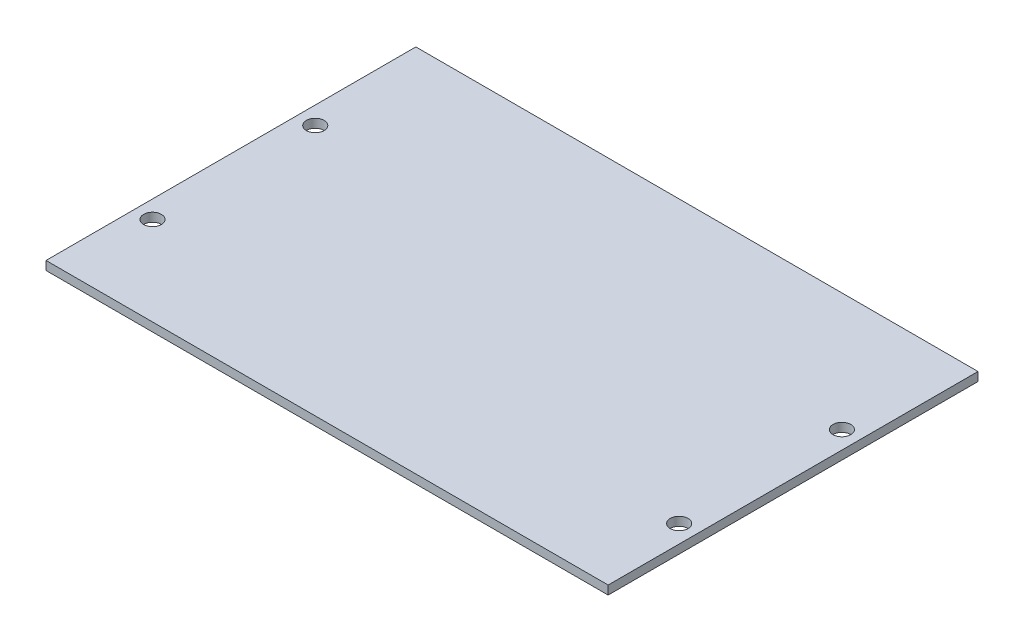
ISO-10303-21;
HEADER;
FILE_DESCRIPTION(('STEP AP214'),'2;1');
FILE_NAME('part.step','',(''),(''),'','','');
FILE_SCHEMA(('AUTOMOTIVE_DESIGN { 1 0 10303 214 1 1 1 1 }'));
ENDSEC;
DATA;
#1=APPLICATION_CONTEXT('core data for automotive mechanical design processes');
#2=APPLICATION_PROTOCOL_DEFINITION('international standard','automotive_design',2000,#1);
#3=PRODUCT_CONTEXT('',#1,'mechanical');
#4=PRODUCT('Part','Part','',(#3));
#5=PRODUCT_RELATED_PRODUCT_CATEGORY('part','',(#4));
#6=PRODUCT_DEFINITION_FORMATION('','',#4);
#7=PRODUCT_DEFINITION_CONTEXT('part definition',#1,'design');
#8=PRODUCT_DEFINITION('design','',#6,#7);
#9=PRODUCT_DEFINITION_SHAPE('','',#8);
#10=(LENGTH_UNIT() NAMED_UNIT(*) SI_UNIT(.MILLI.,.METRE.));
#11=(NAMED_UNIT(*) PLANE_ANGLE_UNIT() SI_UNIT($,.RADIAN.));
#12=(NAMED_UNIT(*) SI_UNIT($,.STERADIAN.) SOLID_ANGLE_UNIT());
#13=UNCERTAINTY_MEASURE_WITH_UNIT(LENGTH_MEASURE(1.E-05),#10,'distance_accuracy_value','');
#14=(GEOMETRIC_REPRESENTATION_CONTEXT(3) GLOBAL_UNCERTAINTY_ASSIGNED_CONTEXT((#13)) GLOBAL_UNIT_ASSIGNED_CONTEXT((#10,
#11,#12)) REPRESENTATION_CONTEXT('',''));
#15=CARTESIAN_POINT('',(0.,0.,0.));
#16=DIRECTION('',(0.,0.,1.));
#17=DIRECTION('',(1.,0.,0.));
#18=AXIS2_PLACEMENT_3D('',#15,#16,#17);
#19=CARTESIAN_POINT('',(-66.0198412698412,1.4986,-35.0257936507937));
#20=DIRECTION('',(1.,0.,0.));
#21=DIRECTION('',(0.,0.,-1.));
#22=AXIS2_PLACEMENT_3D('',#19,#20,#21);
#23=PLANE('',#22);
#24=DIRECTION('',(0.,0.,1.));
#25=VECTOR('',#24,1.);
#26=CARTESIAN_POINT('',(-66.0198412698412,0.,-35.0257936507937));
#27=LINE('',#26,#25);
#28=CARTESIAN_POINT('',(-66.0198412698412,0.,-35.0257936507937));
#29=VERTEX_POINT('',#28);
#30=CARTESIAN_POINT('',(-66.0198412698412,0.,28.4742063492063));
#31=VERTEX_POINT('',#30);
#32=EDGE_CURVE('E95',#29,#31,#27,.T.);
#33=ORIENTED_EDGE('',*,*,#32,.T.);
#34=DIRECTION('',(0.,-1.,0.));
#35=VECTOR('',#34,1.);
#36=CARTESIAN_POINT('',(-66.0198412698412,1.4986,28.4742063492063));
#37=LINE('',#36,#35);
#38=CARTESIAN_POINT('',(-66.0198412698412,1.4986,28.4742063492063));
#39=VERTEX_POINT('',#38);
#40=EDGE_CURVE('E11',#39,#31,#37,.T.);
#41=ORIENTED_EDGE('',*,*,#40,.F.);
#42=DIRECTION('',(0.,0.,1.));
#43=VECTOR('',#42,1.);
#44=CARTESIAN_POINT('',(-66.0198412698412,1.4986,-35.0257936507937));
#45=LINE('',#44,#43);
#46=CARTESIAN_POINT('',(-66.0198412698412,1.4986,-35.0257936507937));
#47=VERTEX_POINT('',#46);
#48=EDGE_CURVE('E83',#47,#39,#45,.T.);
#49=ORIENTED_EDGE('',*,*,#48,.F.);
#50=DIRECTION('',(0.,-1.,0.));
#51=VECTOR('',#50,1.);
#52=CARTESIAN_POINT('',(-66.0198412698412,1.4986,-35.0257936507937));
#53=LINE('',#52,#51);
#54=EDGE_CURVE('E91',#47,#29,#53,.T.);
#55=ORIENTED_EDGE('',*,*,#54,.T.);
#56=EDGE_LOOP('',(#33,#41,#49,#55));
#57=FACE_BOUND('',#56,.T.);
#58=ADVANCED_FACE('F32',(#57),#23,.F.);
#59=CARTESIAN_POINT('',(-66.0198412698412,1.4986,28.4742063492063));
#60=DIRECTION('',(0.,0.,-1.));
#61=DIRECTION('',(-1.,0.,0.));
#62=AXIS2_PLACEMENT_3D('',#59,#60,#61);
#63=PLANE('',#62);
#64=DIRECTION('',(1.,0.,0.));
#65=VECTOR('',#64,1.);
#66=CARTESIAN_POINT('',(-66.0198412698412,0.,28.4742063492063));
#67=LINE('',#66,#65);
#68=CARTESIAN_POINT('',(30.5001587301588,0.,28.4742063492063));
#69=VERTEX_POINT('',#68);
#70=EDGE_CURVE('E87',#31,#69,#67,.T.);
#71=ORIENTED_EDGE('',*,*,#70,.T.);
#72=DIRECTION('',(0.,-1.,0.));
#73=VECTOR('',#72,1.);
#74=CARTESIAN_POINT('',(30.5001587301588,1.4986,28.4742063492063));
#75=LINE('',#74,#73);
#76=CARTESIAN_POINT('',(30.5001587301588,1.4986,28.4742063492063));
#77=VERTEX_POINT('',#76);
#78=EDGE_CURVE('E40',#77,#69,#75,.T.);
#79=ORIENTED_EDGE('',*,*,#78,.F.);
#80=DIRECTION('',(1.,0.,0.));
#81=VECTOR('',#80,1.);
#82=CARTESIAN_POINT('',(-66.0198412698412,1.4986,28.4742063492063));
#83=LINE('',#82,#81);
#84=EDGE_CURVE('E78',#39,#77,#83,.T.);
#85=ORIENTED_EDGE('',*,*,#84,.F.);
#86=ORIENTED_EDGE('',*,*,#40,.T.);
#87=EDGE_LOOP('',(#71,#79,#85,#86));
#88=FACE_BOUND('',#87,.T.);
#89=ADVANCED_FACE('F86',(#88),#63,.F.);
#90=CARTESIAN_POINT('',(30.5001587301588,1.4986,-35.0257936507937));
#91=DIRECTION('',(-1.,0.,0.));
#92=DIRECTION('',(0.,0.,1.));
#93=AXIS2_PLACEMENT_3D('',#90,#91,#92);
#94=PLANE('',#93);
#95=DIRECTION('',(0.,0.,-1.));
#96=VECTOR('',#95,1.);
#97=CARTESIAN_POINT('',(30.5001587301588,0.,-35.0257936507937));
#98=LINE('',#97,#96);
#99=CARTESIAN_POINT('',(30.5001587301588,0.,-35.0257936507937));
#100=VERTEX_POINT('',#99);
#101=EDGE_CURVE('E65',#69,#100,#98,.T.);
#102=ORIENTED_EDGE('',*,*,#101,.T.);
#103=DIRECTION('',(0.,-1.,0.));
#104=VECTOR('',#103,1.);
#105=CARTESIAN_POINT('',(30.5001587301588,1.4986,-35.0257936507937));
#106=LINE('',#105,#104);
#107=CARTESIAN_POINT('',(30.5001587301588,1.4986,-35.0257936507937));
#108=VERTEX_POINT('',#107);
#109=EDGE_CURVE('E88',#108,#100,#106,.T.);
#110=ORIENTED_EDGE('',*,*,#109,.F.);
#111=DIRECTION('',(0.,0.,-1.));
#112=VECTOR('',#111,1.);
#113=CARTESIAN_POINT('',(30.5001587301588,1.4986,-35.0257936507937));
#114=LINE('',#113,#112);
#115=EDGE_CURVE('E81',#77,#108,#114,.T.);
#116=ORIENTED_EDGE('',*,*,#115,.F.);
#117=ORIENTED_EDGE('',*,*,#78,.T.);
#118=EDGE_LOOP('',(#102,#110,#116,#117));
#119=FACE_BOUND('',#118,.T.);
#120=ADVANCED_FACE('F89',(#119),#94,.F.);
#121=CARTESIAN_POINT('',(-66.0198412698412,1.4986,-35.0257936507937));
#122=DIRECTION('',(0.,0.,1.));
#123=DIRECTION('',(1.,0.,0.));
#124=AXIS2_PLACEMENT_3D('',#121,#122,#123);
#125=PLANE('',#124);
#126=DIRECTION('',(-1.,0.,0.));
#127=VECTOR('',#126,1.);
#128=CARTESIAN_POINT('',(-66.0198412698412,0.,-35.0257936507937));
#129=LINE('',#128,#127);
#130=EDGE_CURVE('E71',#100,#29,#129,.T.);
#131=ORIENTED_EDGE('',*,*,#130,.T.);
#132=ORIENTED_EDGE('',*,*,#54,.F.);
#133=DIRECTION('',(-1.,0.,0.));
#134=VECTOR('',#133,1.);
#135=CARTESIAN_POINT('',(-66.0198412698412,1.4986,-35.0257936507937));
#136=LINE('',#135,#134);
#137=EDGE_CURVE('E48',#108,#47,#136,.T.);
#138=ORIENTED_EDGE('',*,*,#137,.F.);
#139=ORIENTED_EDGE('',*,*,#109,.T.);
#140=EDGE_LOOP('',(#131,#132,#138,#139));
#141=FACE_BOUND('',#140,.T.);
#142=ADVANCED_FACE('F103',(#141),#125,.F.);
#143=CARTESIAN_POINT('',(0.,1.4986,0.));
#144=DIRECTION('',(0.,1.,0.));
#145=DIRECTION('',(0.,0.,1.));
#146=AXIS2_PLACEMENT_3D('',#143,#144,#145);
#147=PLANE('',#146);
#148=CARTESIAN_POINT('',(-62.9718412698412,1.4986,13.2342063492063));
#149=DIRECTION('',(0.,1.,0.));
#150=DIRECTION('',(0.,0.,1.));
#151=AXIS2_PLACEMENT_3D('',#148,#149,#150);
#152=CIRCLE('',#151,1.524);
#153=CARTESIAN_POINT('',(-62.9718412698412,1.4986,14.7582063492063));
#154=VERTEX_POINT('',#153);
#155=EDGE_CURVE('E118',#154,#154,#152,.T.);
#156=ORIENTED_EDGE('',*,*,#155,.F.);
#157=EDGE_LOOP('',(#156));
#158=FACE_BOUND('',#157,.T.);
#159=CARTESIAN_POINT('',(27.4521587301588,1.4986,-14.7057936507937));
#160=DIRECTION('',(0.,1.,0.));
#161=DIRECTION('',(0.,0.,1.));
#162=AXIS2_PLACEMENT_3D('',#159,#160,#161);
#163=CIRCLE('',#162,1.524);
#164=CARTESIAN_POINT('',(27.4521587301588,1.4986,-13.1817936507937));
#165=VERTEX_POINT('',#164);
#166=EDGE_CURVE('E119',#165,#165,#163,.T.);
#167=ORIENTED_EDGE('',*,*,#166,.F.);
#168=EDGE_LOOP('',(#167));
#169=FACE_BOUND('',#168,.T.);
#170=CARTESIAN_POINT('',(27.4521587301588,1.4986,13.2342063492063));
#171=DIRECTION('',(0.,1.,0.));
#172=DIRECTION('',(0.,0.,1.));
#173=AXIS2_PLACEMENT_3D('',#170,#171,#172);
#174=CIRCLE('',#173,1.524);
#175=CARTESIAN_POINT('',(27.4521587301588,1.4986,14.7582063492063));
#176=VERTEX_POINT('',#175);
#177=EDGE_CURVE('E129',#176,#176,#174,.T.);
#178=ORIENTED_EDGE('',*,*,#177,.F.);
#179=EDGE_LOOP('',(#178));
#180=FACE_BOUND('',#179,.T.);
#181=CARTESIAN_POINT('',(-62.9718412698412,1.4986,-14.7057936507937));
#182=DIRECTION('',(0.,1.,0.));
#183=DIRECTION('',(0.,0.,1.));
#184=AXIS2_PLACEMENT_3D('',#181,#182,#183);
#185=CIRCLE('',#184,1.524);
#186=CARTESIAN_POINT('',(-62.9718412698412,1.4986,-13.1817936507937));
#187=VERTEX_POINT('',#186);
#188=EDGE_CURVE('E111',#187,#187,#185,.T.);
#189=ORIENTED_EDGE('',*,*,#188,.F.);
#190=EDGE_LOOP('',(#189));
#191=FACE_BOUND('',#190,.T.);
#192=ORIENTED_EDGE('',*,*,#48,.T.);
#193=ORIENTED_EDGE('',*,*,#84,.T.);
#194=ORIENTED_EDGE('',*,*,#115,.T.);
#195=ORIENTED_EDGE('',*,*,#137,.T.);
#196=EDGE_LOOP('',(#192,#193,#194,#195));
#197=FACE_BOUND('',#196,.T.);
#198=ADVANCED_FACE('F79',(#158,#169,#180,#191,#197),#147,.T.);
#199=CARTESIAN_POINT('',(0.,0.,0.));
#200=DIRECTION('',(0.,1.,0.));
#201=DIRECTION('',(0.,0.,1.));
#202=AXIS2_PLACEMENT_3D('',#199,#200,#201);
#203=PLANE('',#202);
#204=CARTESIAN_POINT('',(-62.9718412698412,0.,13.2342063492063));
#205=DIRECTION('',(0.,1.,0.));
#206=DIRECTION('',(0.,0.,1.));
#207=AXIS2_PLACEMENT_3D('',#204,#205,#206);
#208=CIRCLE('',#207,1.524);
#209=CARTESIAN_POINT('',(-62.9718412698412,0.,14.7582063492063));
#210=VERTEX_POINT('',#209);
#211=EDGE_CURVE('E114',#210,#210,#208,.F.);
#212=ORIENTED_EDGE('',*,*,#211,.F.);
#213=EDGE_LOOP('',(#212));
#214=FACE_BOUND('',#213,.T.);
#215=CARTESIAN_POINT('',(27.4521587301588,0.,-14.7057936507937));
#216=DIRECTION('',(0.,1.,0.));
#217=DIRECTION('',(0.,0.,1.));
#218=AXIS2_PLACEMENT_3D('',#215,#216,#217);
#219=CIRCLE('',#218,1.524);
#220=CARTESIAN_POINT('',(27.4521587301588,0.,-13.1817936507937));
#221=VERTEX_POINT('',#220);
#222=EDGE_CURVE('E115',#221,#221,#219,.F.);
#223=ORIENTED_EDGE('',*,*,#222,.F.);
#224=EDGE_LOOP('',(#223));
#225=FACE_BOUND('',#224,.T.);
#226=CARTESIAN_POINT('',(27.4521587301588,0.,13.2342063492063));
#227=DIRECTION('',(0.,1.,0.));
#228=DIRECTION('',(0.,0.,1.));
#229=AXIS2_PLACEMENT_3D('',#226,#227,#228);
#230=CIRCLE('',#229,1.524);
#231=CARTESIAN_POINT('',(27.4521587301588,0.,14.7582063492063));
#232=VERTEX_POINT('',#231);
#233=EDGE_CURVE('E122',#232,#232,#230,.F.);
#234=ORIENTED_EDGE('',*,*,#233,.F.);
#235=EDGE_LOOP('',(#234));
#236=FACE_BOUND('',#235,.T.);
#237=CARTESIAN_POINT('',(-62.9718412698412,0.,-14.7057936507937));
#238=DIRECTION('',(0.,1.,0.));
#239=DIRECTION('',(0.,0.,1.));
#240=AXIS2_PLACEMENT_3D('',#237,#238,#239);
#241=CIRCLE('',#240,1.524);
#242=CARTESIAN_POINT('',(-62.9718412698412,0.,-13.1817936507937));
#243=VERTEX_POINT('',#242);
#244=EDGE_CURVE('E98',#243,#243,#241,.F.);
#245=ORIENTED_EDGE('',*,*,#244,.F.);
#246=EDGE_LOOP('',(#245));
#247=FACE_BOUND('',#246,.T.);
#248=ORIENTED_EDGE('',*,*,#32,.F.);
#249=ORIENTED_EDGE('',*,*,#130,.F.);
#250=ORIENTED_EDGE('',*,*,#101,.F.);
#251=ORIENTED_EDGE('',*,*,#70,.F.);
#252=EDGE_LOOP('',(#248,#249,#250,#251));
#253=FACE_BOUND('',#252,.T.);
#254=ADVANCED_FACE('F106',(#214,#225,#236,#247,#253),#203,.F.);
#255=CARTESIAN_POINT('',(-62.9718412698412,-4.31052293811319,-14.7057936507937));
#256=DIRECTION('',(0.,1.,0.));
#257=DIRECTION('',(0.,0.,1.));
#258=AXIS2_PLACEMENT_3D('',#255,#256,#257);
#259=CYLINDRICAL_SURFACE('',#258,1.524);
#260=ORIENTED_EDGE('',*,*,#244,.T.);
#261=EDGE_LOOP('',(#260));
#262=FACE_BOUND('',#261,.T.);
#263=ORIENTED_EDGE('',*,*,#188,.T.);
#264=EDGE_LOOP('',(#263));
#265=FACE_BOUND('',#264,.T.);
#266=ADVANCED_FACE('F141',(#262,#265),#259,.F.);
#267=CARTESIAN_POINT('',(27.4521587301588,-4.31052293811319,13.2342063492063));
#268=DIRECTION('',(0.,1.,0.));
#269=DIRECTION('',(0.,0.,1.));
#270=AXIS2_PLACEMENT_3D('',#267,#268,#269);
#271=CYLINDRICAL_SURFACE('',#270,1.524);
#272=ORIENTED_EDGE('',*,*,#233,.T.);
#273=EDGE_LOOP('',(#272));
#274=FACE_BOUND('',#273,.T.);
#275=ORIENTED_EDGE('',*,*,#177,.T.);
#276=EDGE_LOOP('',(#275));
#277=FACE_BOUND('',#276,.T.);
#278=ADVANCED_FACE('F133',(#274,#277),#271,.F.);
#279=CARTESIAN_POINT('',(27.4521587301588,-4.31052293811319,-14.7057936507937));
#280=DIRECTION('',(0.,1.,0.));
#281=DIRECTION('',(0.,0.,1.));
#282=AXIS2_PLACEMENT_3D('',#279,#280,#281);
#283=CYLINDRICAL_SURFACE('',#282,1.524);
#284=ORIENTED_EDGE('',*,*,#222,.T.);
#285=EDGE_LOOP('',(#284));
#286=FACE_BOUND('',#285,.T.);
#287=ORIENTED_EDGE('',*,*,#166,.T.);
#288=EDGE_LOOP('',(#287));
#289=FACE_BOUND('',#288,.T.);
#290=ADVANCED_FACE('F149',(#286,#289),#283,.F.);
#291=CARTESIAN_POINT('',(-62.9718412698412,-4.31052293811319,13.2342063492063));
#292=DIRECTION('',(0.,1.,0.));
#293=DIRECTION('',(0.,0.,1.));
#294=AXIS2_PLACEMENT_3D('',#291,#292,#293);
#295=CYLINDRICAL_SURFACE('',#294,1.524);
#296=ORIENTED_EDGE('',*,*,#211,.T.);
#297=EDGE_LOOP('',(#296));
#298=FACE_BOUND('',#297,.T.);
#299=ORIENTED_EDGE('',*,*,#155,.T.);
#300=EDGE_LOOP('',(#299));
#301=FACE_BOUND('',#300,.T.);
#302=ADVANCED_FACE('F196',(#298,#301),#295,.F.);
#303=CLOSED_SHELL('',(#58,#89,#120,#142,#198,#254,#266,#278,#290,#302));
#304=MANIFOLD_SOLID_BREP('B2',#303);
#305=ADVANCED_BREP_SHAPE_REPRESENTATION('',(#18,#304),#14);
#306=SHAPE_DEFINITION_REPRESENTATION(#9,#305);
ENDSEC;
END-ISO-10303-21;
